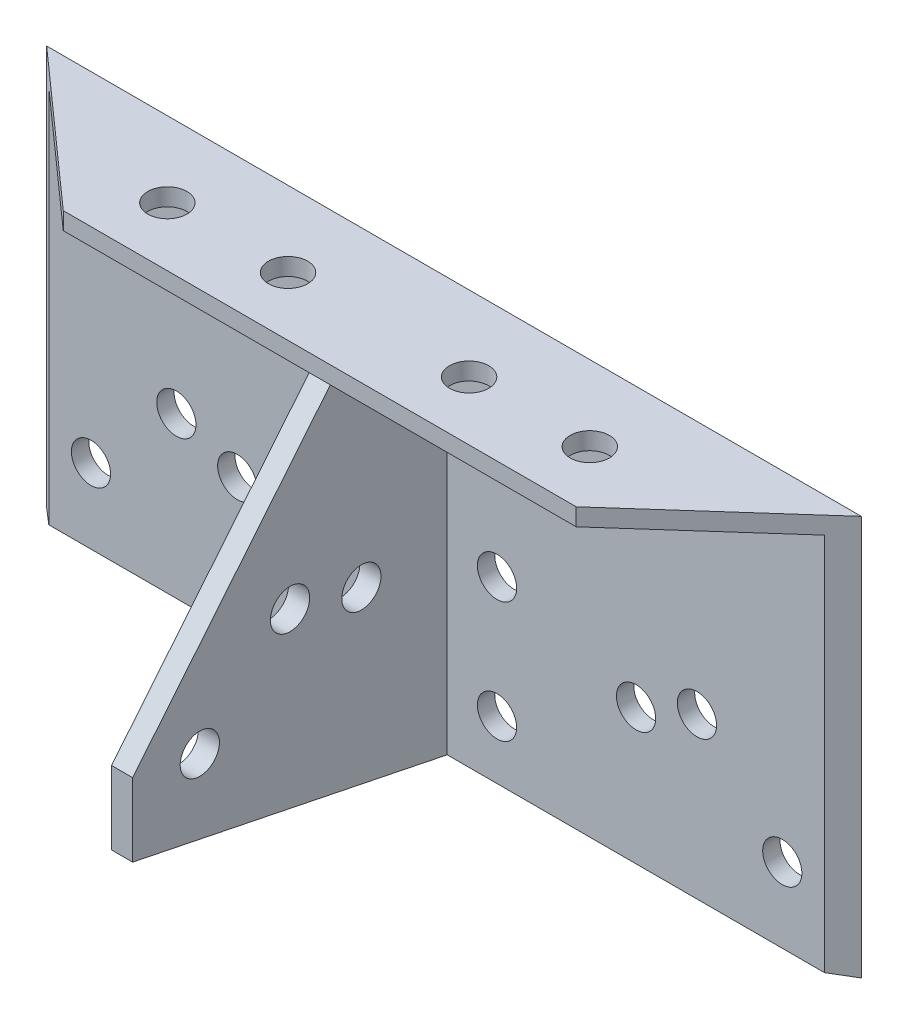
ISO-10303-21;
HEADER;
FILE_DESCRIPTION(('STEP AP214'),'2;1');
FILE_NAME('part.step','',(''),(''),'','','');
FILE_SCHEMA(('AUTOMOTIVE_DESIGN { 1 0 10303 214 1 1 1 1 }'));
ENDSEC;
DATA;
#1=APPLICATION_CONTEXT('core data for automotive mechanical design processes');
#2=APPLICATION_PROTOCOL_DEFINITION('international standard','automotive_design',2000,#1);
#3=PRODUCT_CONTEXT('',#1,'mechanical');
#4=PRODUCT('Part','Part','',(#3));
#5=PRODUCT_RELATED_PRODUCT_CATEGORY('part','',(#4));
#6=PRODUCT_DEFINITION_FORMATION('','',#4);
#7=PRODUCT_DEFINITION_CONTEXT('part definition',#1,'design');
#8=PRODUCT_DEFINITION('design','',#6,#7);
#9=PRODUCT_DEFINITION_SHAPE('','',#8);
#10=(LENGTH_UNIT() NAMED_UNIT(*) SI_UNIT(.MILLI.,.METRE.));
#11=(NAMED_UNIT(*) PLANE_ANGLE_UNIT() SI_UNIT($,.RADIAN.));
#12=(NAMED_UNIT(*) SI_UNIT($,.STERADIAN.) SOLID_ANGLE_UNIT());
#13=UNCERTAINTY_MEASURE_WITH_UNIT(LENGTH_MEASURE(1.E-05),#10,'distance_accuracy_value','');
#14=(GEOMETRIC_REPRESENTATION_CONTEXT(3) GLOBAL_UNCERTAINTY_ASSIGNED_CONTEXT((#13)) GLOBAL_UNIT_ASSIGNED_CONTEXT((#10,
#11,#12)) REPRESENTATION_CONTEXT('',''));
#15=CARTESIAN_POINT('',(0.,0.,0.));
#16=DIRECTION('',(0.,0.,1.));
#17=DIRECTION('',(1.,0.,0.));
#18=AXIS2_PLACEMENT_3D('',#15,#16,#17);
#19=CARTESIAN_POINT('',(0.,265.,11.5));
#20=DIRECTION('',(0.,0.,-1.));
#21=DIRECTION('',(-1.,0.,0.));
#22=AXIS2_PLACEMENT_3D('',#19,#20,#21);
#23=PLANE('',#22);
#24=CARTESIAN_POINT('',(230.,41.,11.5));
#25=DIRECTION('',(0.,0.,1.));
#26=DIRECTION('',(1.,0.,0.));
#27=AXIS2_PLACEMENT_3D('',#24,#25,#26);
#28=CIRCLE('',#27,13.);
#29=CARTESIAN_POINT('',(243.,41.,11.5));
#30=VERTEX_POINT('',#29);
#31=EDGE_CURVE('E655',#30,#30,#28,.T.);
#32=ORIENTED_EDGE('',*,*,#31,.F.);
#33=EDGE_LOOP('',(#32));
#34=FACE_BOUND('',#33,.T.);
#35=CARTESIAN_POINT('',(97.4659453904821,108.465945390483,11.5));
#36=DIRECTION('',(0.,0.,1.));
#37=DIRECTION('',(1.,0.,0.));
#38=AXIS2_PLACEMENT_3D('',#35,#36,#37);
#39=CIRCLE('',#38,13.);
#40=CARTESIAN_POINT('',(110.465945390482,108.465945390483,11.5));
#41=VERTEX_POINT('',#40);
#42=EDGE_CURVE('E314',#41,#41,#39,.T.);
#43=ORIENTED_EDGE('',*,*,#42,.F.);
#44=EDGE_LOOP('',(#43));
#45=FACE_BOUND('',#44,.T.);
#46=CARTESIAN_POINT('',(40.8974028955581,51.897402895559,11.5));
#47=DIRECTION('',(0.,0.,1.));
#48=DIRECTION('',(1.,0.,0.));
#49=AXIS2_PLACEMENT_3D('',#46,#47,#48);
#50=CIRCLE('',#49,13.);
#51=CARTESIAN_POINT('',(53.8974028955582,51.897402895559,11.5));
#52=VERTEX_POINT('',#51);
#53=EDGE_CURVE('E315',#52,#52,#50,.T.);
#54=ORIENTED_EDGE('',*,*,#53,.F.);
#55=EDGE_LOOP('',(#54));
#56=FACE_BOUND('',#55,.T.);
#57=CARTESIAN_POINT('',(230.,121.,11.5));
#58=DIRECTION('',(0.,0.,1.));
#59=DIRECTION('',(1.,0.,0.));
#60=AXIS2_PLACEMENT_3D('',#57,#58,#59);
#61=CIRCLE('',#60,13.);
#62=CARTESIAN_POINT('',(243.,121.,11.5));
#63=VERTEX_POINT('',#62);
#64=EDGE_CURVE('E633',#63,#63,#61,.T.);
#65=ORIENTED_EDGE('',*,*,#64,.F.);
#66=EDGE_LOOP('',(#65));
#67=FACE_BOUND('',#66,.T.);
#68=CARTESIAN_POINT('',(137.829012361263,92.2615340814046,11.5));
#69=DIRECTION('',(0.,0.,1.));
#70=DIRECTION('',(1.,0.,0.));
#71=AXIS2_PLACEMENT_3D('',#68,#69,#70);
#72=CIRCLE('',#71,13.);
#73=CARTESIAN_POINT('',(150.829012361263,92.2615340814046,11.5));
#74=VERTEX_POINT('',#73);
#75=EDGE_CURVE('E636',#74,#74,#72,.T.);
#76=ORIENTED_EDGE('',*,*,#75,.F.);
#77=EDGE_LOOP('',(#76));
#78=FACE_BOUND('',#77,.T.);
#79=DIRECTION('',(0.,-1.,0.));
#80=VECTOR('',#79,1.);
#81=CARTESIAN_POINT('',(12.9213483146067,265.,11.5));
#82=LINE('',#81,#80);
#83=CARTESIAN_POINT('',(12.9213483146067,253.5,11.5));
#84=VERTEX_POINT('',#83);
#85=CARTESIAN_POINT('',(12.9213483146067,2.35227272727279,11.5));
#86=VERTEX_POINT('',#85);
#87=EDGE_CURVE('E171',#84,#86,#82,.T.);
#88=ORIENTED_EDGE('',*,*,#87,.T.);
#89=DIRECTION('',(1.,0.,0.));
#90=VECTOR('',#89,1.);
#91=CARTESIAN_POINT('',(0.,2.35227272727279,11.5));
#92=LINE('',#91,#90);
#93=CARTESIAN_POINT('',(263.,2.35227272727273,11.5));
#94=VERTEX_POINT('',#93);
#95=EDGE_CURVE('E330',#86,#94,#92,.T.);
#96=ORIENTED_EDGE('',*,*,#95,.T.);
#97=DIRECTION('',(0.,-1.,0.));
#98=VECTOR('',#97,1.);
#99=CARTESIAN_POINT('',(263.,253.5,11.5));
#100=LINE('',#99,#98);
#101=CARTESIAN_POINT('',(263.,253.5,11.5));
#102=VERTEX_POINT('',#101);
#103=EDGE_CURVE('E329',#102,#94,#100,.T.);
#104=ORIENTED_EDGE('',*,*,#103,.F.);
#105=DIRECTION('',(1.,0.,0.));
#106=VECTOR('',#105,1.);
#107=CARTESIAN_POINT('',(0.,253.5,11.5));
#108=LINE('',#107,#106);
#109=EDGE_CURVE('E153',#84,#102,#108,.T.);
#110=ORIENTED_EDGE('',*,*,#109,.F.);
#111=EDGE_LOOP('',(#88,#96,#104,#110));
#112=FACE_BOUND('',#111,.T.);
#113=ADVANCED_FACE('F36',(#34,#45,#56,#67,#78,#112),#23,.F.);
#114=CARTESIAN_POINT('',(442.534054609518,108.465945390483,11.5));
#115=DIRECTION('',(0.,0.,1.));
#116=DIRECTION('',(-1.,0.,0.));
#117=AXIS2_PLACEMENT_3D('',#114,#115,#116);
#118=CIRCLE('',#117,13.);
#119=CARTESIAN_POINT('',(429.534054609518,108.465945390483,11.5));
#120=VERTEX_POINT('',#119);
#121=EDGE_CURVE('E642',#120,#120,#118,.T.);
#122=ORIENTED_EDGE('',*,*,#121,.F.);
#123=EDGE_LOOP('',(#122));
#124=FACE_BOUND('',#123,.T.);
#125=CARTESIAN_POINT('',(310.,121.,11.5));
#126=DIRECTION('',(0.,0.,1.));
#127=DIRECTION('',(-1.,0.,0.));
#128=AXIS2_PLACEMENT_3D('',#125,#126,#127);
#129=CIRCLE('',#128,13.);
#130=CARTESIAN_POINT('',(297.,121.,11.5));
#131=VERTEX_POINT('',#130);
#132=EDGE_CURVE('E639',#131,#131,#129,.T.);
#133=ORIENTED_EDGE('',*,*,#132,.F.);
#134=EDGE_LOOP('',(#133));
#135=FACE_BOUND('',#134,.T.);
#136=CARTESIAN_POINT('',(499.102597104442,51.8974028955591,11.5));
#137=DIRECTION('',(0.,0.,1.));
#138=DIRECTION('',(-1.,0.,0.));
#139=AXIS2_PLACEMENT_3D('',#136,#137,#138);
#140=CIRCLE('',#139,13.0000000000001);
#141=CARTESIAN_POINT('',(486.102597104442,51.8974028955591,11.5));
#142=VERTEX_POINT('',#141);
#143=EDGE_CURVE('E663',#142,#142,#140,.T.);
#144=ORIENTED_EDGE('',*,*,#143,.F.);
#145=EDGE_LOOP('',(#144));
#146=FACE_BOUND('',#145,.T.);
#147=CARTESIAN_POINT('',(310.,41.,11.5));
#148=DIRECTION('',(0.,0.,1.));
#149=DIRECTION('',(-1.,0.,0.));
#150=AXIS2_PLACEMENT_3D('',#147,#148,#149);
#151=CIRCLE('',#150,13.);
#152=CARTESIAN_POINT('',(297.,41.,11.5));
#153=VERTEX_POINT('',#152);
#154=EDGE_CURVE('E650',#153,#153,#151,.T.);
#155=ORIENTED_EDGE('',*,*,#154,.F.);
#156=EDGE_LOOP('',(#155));
#157=FACE_BOUND('',#156,.T.);
#158=CARTESIAN_POINT('',(402.170987638737,92.2615340814046,11.5));
#159=DIRECTION('',(0.,0.,1.));
#160=DIRECTION('',(-1.,0.,0.));
#161=AXIS2_PLACEMENT_3D('',#158,#159,#160);
#162=CIRCLE('',#161,13.);
#163=CARTESIAN_POINT('',(389.170987638737,92.2615340814046,11.5));
#164=VERTEX_POINT('',#163);
#165=EDGE_CURVE('E165',#164,#164,#162,.T.);
#166=ORIENTED_EDGE('',*,*,#165,.F.);
#167=EDGE_LOOP('',(#166));
#168=FACE_BOUND('',#167,.T.);
#169=DIRECTION('',(0.,1.,0.));
#170=VECTOR('',#169,1.);
#171=CARTESIAN_POINT('',(277.,253.5,11.5));
#172=LINE('',#171,#170);
#173=CARTESIAN_POINT('',(277.,2.35227272727274,11.5000000000001));
#174=VERTEX_POINT('',#173);
#175=CARTESIAN_POINT('',(277.,253.5,11.5));
#176=VERTEX_POINT('',#175);
#177=EDGE_CURVE('E232',#174,#176,#172,.T.);
#178=ORIENTED_EDGE('',*,*,#177,.F.);
#179=DIRECTION('',(-1.,0.,0.));
#180=VECTOR('',#179,1.);
#181=CARTESIAN_POINT('',(540.,2.35227272727274,11.5000000000001));
#182=LINE('',#181,#180);
#183=CARTESIAN_POINT('',(527.078651685393,2.35227272727274,11.5000000000001));
#184=VERTEX_POINT('',#183);
#185=EDGE_CURVE('E138',#184,#174,#182,.T.);
#186=ORIENTED_EDGE('',*,*,#185,.F.);
#187=DIRECTION('',(0.,1.,0.));
#188=VECTOR('',#187,1.);
#189=CARTESIAN_POINT('',(527.078651685393,265.,11.5));
#190=LINE('',#189,#188);
#191=CARTESIAN_POINT('',(527.078651685393,253.5,11.5));
#192=VERTEX_POINT('',#191);
#193=EDGE_CURVE('E136',#184,#192,#190,.T.);
#194=ORIENTED_EDGE('',*,*,#193,.T.);
#195=EDGE_CURVE('E158',#176,#192,#108,.T.);
#196=ORIENTED_EDGE('',*,*,#195,.F.);
#197=EDGE_LOOP('',(#178,#186,#194,#196));
#198=FACE_BOUND('',#197,.T.);
#199=ADVANCED_FACE('F274',(#124,#135,#146,#157,#168,#198),#23,.F.);
#200=CARTESIAN_POINT('',(0.,253.5,89.));
#201=DIRECTION('',(0.,1.,0.));
#202=DIRECTION('',(0.,0.,1.));
#203=AXIS2_PLACEMENT_3D('',#200,#201,#202);
#204=PLANE('',#203);
#205=CARTESIAN_POINT('',(210.,253.5,50.));
#206=DIRECTION('',(0.,1.,0.));
#207=DIRECTION('',(0.,0.,1.));
#208=AXIS2_PLACEMENT_3D('',#205,#206,#207);
#209=CIRCLE('',#208,13.);
#210=CARTESIAN_POINT('',(210.,253.5,63.));
#211=VERTEX_POINT('',#210);
#212=EDGE_CURVE('E191',#211,#211,#209,.T.);
#213=ORIENTED_EDGE('',*,*,#212,.T.);
#214=EDGE_LOOP('',(#213));
#215=FACE_BOUND('',#214,.T.);
#216=CARTESIAN_POINT('',(130.,253.5,50.));
#217=DIRECTION('',(0.,1.,0.));
#218=DIRECTION('',(0.,0.,1.));
#219=AXIS2_PLACEMENT_3D('',#216,#217,#218);
#220=CIRCLE('',#219,13.);
#221=CARTESIAN_POINT('',(130.,253.5,63.));
#222=VERTEX_POINT('',#221);
#223=EDGE_CURVE('E243',#222,#222,#220,.T.);
#224=ORIENTED_EDGE('',*,*,#223,.T.);
#225=EDGE_LOOP('',(#224));
#226=FACE_BOUND('',#225,.T.);
#227=DIRECTION('',(0.,0.,-1.));
#228=VECTOR('',#227,1.);
#229=CARTESIAN_POINT('',(263.,253.5,220.));
#230=LINE('',#229,#228);
#231=CARTESIAN_POINT('',(263.,253.5,89.));
#232=VERTEX_POINT('',#231);
#233=EDGE_CURVE('E215',#232,#102,#230,.T.);
#234=ORIENTED_EDGE('',*,*,#233,.F.);
#235=DIRECTION('',(1.,0.,0.));
#236=VECTOR('',#235,1.);
#237=CARTESIAN_POINT('',(0.,253.5,89.));
#238=LINE('',#237,#236);
#239=CARTESIAN_POINT('',(100.,253.5,89.));
#240=VERTEX_POINT('',#239);
#241=EDGE_CURVE('E200',#240,#232,#238,.T.);
#242=ORIENTED_EDGE('',*,*,#241,.F.);
#243=DIRECTION('',(-0.746997038573461,0.,-0.66482736433038));
#244=VECTOR('',#243,1.);
#245=CARTESIAN_POINT('',(44.199542436248,253.5,39.3375927682607));
#246=LINE('',#245,#244);
#247=EDGE_CURVE('E196',#240,#84,#246,.T.);
#248=ORIENTED_EDGE('',*,*,#247,.T.);
#249=ORIENTED_EDGE('',*,*,#109,.T.);
#250=EDGE_LOOP('',(#234,#242,#248,#249));
#251=FACE_BOUND('',#250,.T.);
#252=ADVANCED_FACE('F223',(#215,#226,#251),#204,.F.);
#253=CARTESIAN_POINT('',(410.,253.5,50.));
#254=DIRECTION('',(0.,1.,0.));
#255=DIRECTION('',(0.,0.,1.));
#256=AXIS2_PLACEMENT_3D('',#253,#254,#255);
#257=CIRCLE('',#256,13.);
#258=CARTESIAN_POINT('',(410.,253.5,63.));
#259=VERTEX_POINT('',#258);
#260=EDGE_CURVE('E240',#259,#259,#257,.T.);
#261=ORIENTED_EDGE('',*,*,#260,.T.);
#262=EDGE_LOOP('',(#261));
#263=FACE_BOUND('',#262,.T.);
#264=CARTESIAN_POINT('',(330.,253.5,50.));
#265=DIRECTION('',(0.,1.,0.));
#266=DIRECTION('',(0.,0.,1.));
#267=AXIS2_PLACEMENT_3D('',#264,#265,#266);
#268=CIRCLE('',#267,13.);
#269=CARTESIAN_POINT('',(330.,253.5,62.9999999999999));
#270=VERTEX_POINT('',#269);
#271=EDGE_CURVE('E172',#270,#270,#268,.T.);
#272=ORIENTED_EDGE('',*,*,#271,.T.);
#273=EDGE_LOOP('',(#272));
#274=FACE_BOUND('',#273,.T.);
#275=DIRECTION('',(0.,0.,-1.));
#276=VECTOR('',#275,1.);
#277=CARTESIAN_POINT('',(277.,253.5,220.));
#278=LINE('',#277,#276);
#279=CARTESIAN_POINT('',(277.,253.5,89.));
#280=VERTEX_POINT('',#279);
#281=EDGE_CURVE('E225',#280,#176,#278,.T.);
#282=ORIENTED_EDGE('',*,*,#281,.T.);
#283=ORIENTED_EDGE('',*,*,#195,.T.);
#284=DIRECTION('',(-0.746997038573461,0.,0.66482736433038));
#285=VECTOR('',#284,1.);
#286=CARTESIAN_POINT('',(194.477986719491,253.5,307.514591819653));
#287=LINE('',#286,#285);
#288=CARTESIAN_POINT('',(440.,253.5,89.));
#289=VERTEX_POINT('',#288);
#290=EDGE_CURVE('E178',#192,#289,#287,.T.);
#291=ORIENTED_EDGE('',*,*,#290,.T.);
#292=EDGE_CURVE('E157',#280,#289,#238,.T.);
#293=ORIENTED_EDGE('',*,*,#292,.F.);
#294=EDGE_LOOP('',(#282,#283,#291,#293));
#295=FACE_BOUND('',#294,.T.);
#296=ADVANCED_FACE('F185',(#263,#274,#295),#204,.F.);
#297=CARTESIAN_POINT('',(0.,265.,0.));
#298=DIRECTION('',(0.,0.,-1.));
#299=DIRECTION('',(-1.,0.,0.));
#300=AXIS2_PLACEMENT_3D('',#297,#298,#299);
#301=PLANE('',#300);
#302=CARTESIAN_POINT('',(442.534054609518,108.465945390483,0.));
#303=DIRECTION('',(0.,0.,1.));
#304=DIRECTION('',(-1.,0.,0.));
#305=AXIS2_PLACEMENT_3D('',#302,#303,#304);
#306=CIRCLE('',#305,13.);
#307=CARTESIAN_POINT('',(429.534054609518,108.465945390483,0.));
#308=VERTEX_POINT('',#307);
#309=EDGE_CURVE('E297',#308,#308,#306,.T.);
#310=ORIENTED_EDGE('',*,*,#309,.T.);
#311=EDGE_LOOP('',(#310));
#312=FACE_BOUND('',#311,.T.);
#313=CARTESIAN_POINT('',(310.,121.,0.));
#314=DIRECTION('',(0.,0.,1.));
#315=DIRECTION('',(-1.,0.,0.));
#316=AXIS2_PLACEMENT_3D('',#313,#314,#315);
#317=CIRCLE('',#316,13.);
#318=CARTESIAN_POINT('',(297.,121.,0.));
#319=VERTEX_POINT('',#318);
#320=EDGE_CURVE('E301',#319,#319,#317,.T.);
#321=ORIENTED_EDGE('',*,*,#320,.T.);
#322=EDGE_LOOP('',(#321));
#323=FACE_BOUND('',#322,.T.);
#324=CARTESIAN_POINT('',(230.,41.,0.));
#325=DIRECTION('',(0.,0.,1.));
#326=DIRECTION('',(1.,0.,0.));
#327=AXIS2_PLACEMENT_3D('',#324,#325,#326);
#328=CIRCLE('',#327,13.);
#329=CARTESIAN_POINT('',(243.,41.,0.));
#330=VERTEX_POINT('',#329);
#331=EDGE_CURVE('E305',#330,#330,#328,.T.);
#332=ORIENTED_EDGE('',*,*,#331,.T.);
#333=EDGE_LOOP('',(#332));
#334=FACE_BOUND('',#333,.T.);
#335=CARTESIAN_POINT('',(499.102597104442,51.8974028955591,0.));
#336=DIRECTION('',(0.,0.,1.));
#337=DIRECTION('',(-1.,0.,0.));
#338=AXIS2_PLACEMENT_3D('',#335,#336,#337);
#339=CIRCLE('',#338,13.0000000000001);
#340=CARTESIAN_POINT('',(486.102597104442,51.8974028955591,0.));
#341=VERTEX_POINT('',#340);
#342=EDGE_CURVE('E309',#341,#341,#339,.T.);
#343=ORIENTED_EDGE('',*,*,#342,.T.);
#344=EDGE_LOOP('',(#343));
#345=FACE_BOUND('',#344,.T.);
#346=CARTESIAN_POINT('',(97.4659453904821,108.465945390483,0.));
#347=DIRECTION('',(0.,0.,1.));
#348=DIRECTION('',(1.,0.,0.));
#349=AXIS2_PLACEMENT_3D('',#346,#347,#348);
#350=CIRCLE('',#349,13.);
#351=CARTESIAN_POINT('',(110.465945390482,108.465945390483,0.));
#352=VERTEX_POINT('',#351);
#353=EDGE_CURVE('E312',#352,#352,#350,.T.);
#354=ORIENTED_EDGE('',*,*,#353,.T.);
#355=EDGE_LOOP('',(#354));
#356=FACE_BOUND('',#355,.T.);
#357=DIRECTION('',(0.,-1.,0.));
#358=VECTOR('',#357,1.);
#359=CARTESIAN_POINT('',(0.,0.,0.));
#360=LINE('',#359,#358);
#361=CARTESIAN_POINT('',(0.,265.,0.));
#362=VERTEX_POINT('',#361);
#363=CARTESIAN_POINT('',(0.,0.,0.));
#364=VERTEX_POINT('',#363);
#365=EDGE_CURVE('E129',#362,#364,#360,.T.);
#366=ORIENTED_EDGE('',*,*,#365,.F.);
#367=DIRECTION('',(-1.,0.,0.));
#368=VECTOR('',#367,1.);
#369=CARTESIAN_POINT('',(0.,265.,0.));
#370=LINE('',#369,#368);
#371=CARTESIAN_POINT('',(540.,265.,0.));
#372=VERTEX_POINT('',#371);
#373=EDGE_CURVE('E144',#372,#362,#370,.T.);
#374=ORIENTED_EDGE('',*,*,#373,.F.);
#375=DIRECTION('',(0.,1.,0.));
#376=VECTOR('',#375,1.);
#377=CARTESIAN_POINT('',(540.,0.,0.));
#378=LINE('',#377,#376);
#379=CARTESIAN_POINT('',(540.,0.,0.));
#380=VERTEX_POINT('',#379);
#381=EDGE_CURVE('E128',#380,#372,#378,.T.);
#382=ORIENTED_EDGE('',*,*,#381,.F.);
#383=DIRECTION('',(1.,0.,0.));
#384=VECTOR('',#383,1.);
#385=CARTESIAN_POINT('',(0.,0.,0.));
#386=LINE('',#385,#384);
#387=EDGE_CURVE('E117',#364,#380,#386,.T.);
#388=ORIENTED_EDGE('',*,*,#387,.F.);
#389=EDGE_LOOP('',(#366,#374,#382,#388));
#390=FACE_BOUND('',#389,.T.);
#391=CARTESIAN_POINT('',(40.8974028955581,51.897402895559,0.));
#392=DIRECTION('',(0.,0.,1.));
#393=DIRECTION('',(1.,0.,0.));
#394=AXIS2_PLACEMENT_3D('',#391,#392,#393);
#395=CIRCLE('',#394,13.);
#396=CARTESIAN_POINT('',(53.8974028955582,51.897402895559,0.));
#397=VERTEX_POINT('',#396);
#398=EDGE_CURVE('E320',#397,#397,#395,.T.);
#399=ORIENTED_EDGE('',*,*,#398,.T.);
#400=EDGE_LOOP('',(#399));
#401=FACE_BOUND('',#400,.T.);
#402=CARTESIAN_POINT('',(230.,121.,0.));
#403=DIRECTION('',(0.,0.,1.));
#404=DIRECTION('',(1.,0.,0.));
#405=AXIS2_PLACEMENT_3D('',#402,#403,#404);
#406=CIRCLE('',#405,13.);
#407=CARTESIAN_POINT('',(243.,121.,0.));
#408=VERTEX_POINT('',#407);
#409=EDGE_CURVE('E658',#408,#408,#406,.T.);
#410=ORIENTED_EDGE('',*,*,#409,.T.);
#411=EDGE_LOOP('',(#410));
#412=FACE_BOUND('',#411,.T.);
#413=CARTESIAN_POINT('',(310.,41.,0.));
#414=DIRECTION('',(0.,0.,1.));
#415=DIRECTION('',(-1.,0.,0.));
#416=AXIS2_PLACEMENT_3D('',#413,#414,#415);
#417=CIRCLE('',#416,13.);
#418=CARTESIAN_POINT('',(297.,41.,0.));
#419=VERTEX_POINT('',#418);
#420=EDGE_CURVE('E648',#419,#419,#417,.T.);
#421=ORIENTED_EDGE('',*,*,#420,.T.);
#422=EDGE_LOOP('',(#421));
#423=FACE_BOUND('',#422,.T.);
#424=CARTESIAN_POINT('',(137.829012361263,92.2615340814046,0.));
#425=DIRECTION('',(0.,0.,1.));
#426=DIRECTION('',(1.,0.,0.));
#427=AXIS2_PLACEMENT_3D('',#424,#425,#426);
#428=CIRCLE('',#427,13.);
#429=CARTESIAN_POINT('',(150.829012361263,92.2615340814046,0.));
#430=VERTEX_POINT('',#429);
#431=EDGE_CURVE('E637',#430,#430,#428,.T.);
#432=ORIENTED_EDGE('',*,*,#431,.T.);
#433=EDGE_LOOP('',(#432));
#434=FACE_BOUND('',#433,.T.);
#435=CARTESIAN_POINT('',(402.170987638737,92.2615340814046,0.));
#436=DIRECTION('',(0.,0.,1.));
#437=DIRECTION('',(-1.,0.,0.));
#438=AXIS2_PLACEMENT_3D('',#435,#436,#437);
#439=CIRCLE('',#438,13.);
#440=CARTESIAN_POINT('',(389.170987638737,92.2615340814046,0.));
#441=VERTEX_POINT('',#440);
#442=EDGE_CURVE('E205',#441,#441,#439,.T.);
#443=ORIENTED_EDGE('',*,*,#442,.T.);
#444=EDGE_LOOP('',(#443));
#445=FACE_BOUND('',#444,.T.);
#446=ADVANCED_FACE('F141',(#312,#323,#334,#345,#356,#390,#401,#412,#423,#434,#445),#301,.T.);
#447=CARTESIAN_POINT('',(0.,265.,11.5));
#448=DIRECTION('',(0.,-1.,0.));
#449=DIRECTION('',(0.,0.,-1.));
#450=AXIS2_PLACEMENT_3D('',#447,#448,#449);
#451=PLANE('',#450);
#452=CARTESIAN_POINT('',(330.,265.,50.));
#453=DIRECTION('',(0.,1.,0.));
#454=DIRECTION('',(0.,0.,-1.));
#455=AXIS2_PLACEMENT_3D('',#452,#453,#454);
#456=CIRCLE('',#455,13.);
#457=CARTESIAN_POINT('',(330.,265.,37.));
#458=VERTEX_POINT('',#457);
#459=EDGE_CURVE('E228',#458,#458,#456,.T.);
#460=ORIENTED_EDGE('',*,*,#459,.F.);
#461=EDGE_LOOP('',(#460));
#462=FACE_BOUND('',#461,.T.);
#463=CARTESIAN_POINT('',(410.,265.,50.));
#464=DIRECTION('',(0.,1.,0.));
#465=DIRECTION('',(0.,0.,-1.));
#466=AXIS2_PLACEMENT_3D('',#463,#464,#465);
#467=CIRCLE('',#466,13.);
#468=CARTESIAN_POINT('',(410.,265.,37.));
#469=VERTEX_POINT('',#468);
#470=EDGE_CURVE('E237',#469,#469,#467,.T.);
#471=ORIENTED_EDGE('',*,*,#470,.F.);
#472=EDGE_LOOP('',(#471));
#473=FACE_BOUND('',#472,.T.);
#474=CARTESIAN_POINT('',(130.,265.,50.));
#475=DIRECTION('',(0.,1.,0.));
#476=DIRECTION('',(0.,0.,1.));
#477=AXIS2_PLACEMENT_3D('',#474,#475,#476);
#478=CIRCLE('',#477,13.);
#479=CARTESIAN_POINT('',(130.,265.,63.));
#480=VERTEX_POINT('',#479);
#481=EDGE_CURVE('E241',#480,#480,#478,.T.);
#482=ORIENTED_EDGE('',*,*,#481,.F.);
#483=EDGE_LOOP('',(#482));
#484=FACE_BOUND('',#483,.T.);
#485=CARTESIAN_POINT('',(210.,265.,50.));
#486=DIRECTION('',(0.,1.,0.));
#487=DIRECTION('',(0.,0.,1.));
#488=AXIS2_PLACEMENT_3D('',#485,#486,#487);
#489=CIRCLE('',#488,13.);
#490=CARTESIAN_POINT('',(210.,265.,63.));
#491=VERTEX_POINT('',#490);
#492=EDGE_CURVE('E244',#491,#491,#489,.T.);
#493=ORIENTED_EDGE('',*,*,#492,.F.);
#494=EDGE_LOOP('',(#493));
#495=FACE_BOUND('',#494,.T.);
#496=DIRECTION('',(-1.,0.,0.));
#497=VECTOR('',#496,1.);
#498=CARTESIAN_POINT('',(0.,265.,89.));
#499=LINE('',#498,#497);
#500=CARTESIAN_POINT('',(440.,265.,89.));
#501=VERTEX_POINT('',#500);
#502=CARTESIAN_POINT('',(100.,265.,89.));
#503=VERTEX_POINT('',#502);
#504=EDGE_CURVE('E163',#501,#503,#499,.T.);
#505=ORIENTED_EDGE('',*,*,#504,.F.);
#506=DIRECTION('',(-0.746997038573461,0.,0.66482736433038));
#507=VECTOR('',#506,1.);
#508=CARTESIAN_POINT('',(540.,265.,0.));
#509=LINE('',#508,#507);
#510=EDGE_CURVE('E179',#372,#501,#509,.T.);
#511=ORIENTED_EDGE('',*,*,#510,.F.);
#512=ORIENTED_EDGE('',*,*,#373,.T.);
#513=DIRECTION('',(-0.746997038573461,0.,-0.66482736433038));
#514=VECTOR('',#513,1.);
#515=CARTESIAN_POINT('',(0.,265.,0.));
#516=LINE('',#515,#514);
#517=EDGE_CURVE('E189',#503,#362,#516,.T.);
#518=ORIENTED_EDGE('',*,*,#517,.F.);
#519=EDGE_LOOP('',(#505,#511,#512,#518));
#520=FACE_BOUND('',#519,.T.);
#521=ADVANCED_FACE('F38',(#462,#473,#484,#495,#520),#451,.F.);
#522=CARTESIAN_POINT('',(97.4659453904821,108.465945390483,11.5));
#523=DIRECTION('',(0.,0.,-1.));
#524=DIRECTION('',(-1.,0.,0.));
#525=AXIS2_PLACEMENT_3D('',#522,#523,#524);
#526=CYLINDRICAL_SURFACE('',#525,13.);
#527=ORIENTED_EDGE('',*,*,#42,.T.);
#528=EDGE_LOOP('',(#527));
#529=FACE_BOUND('',#528,.T.);
#530=ORIENTED_EDGE('',*,*,#353,.F.);
#531=EDGE_LOOP('',(#530));
#532=FACE_BOUND('',#531,.T.);
#533=ADVANCED_FACE('F284',(#529,#532),#526,.F.);
#534=CARTESIAN_POINT('',(40.8974028955581,51.897402895559,11.5));
#535=DIRECTION('',(0.,0.,-1.));
#536=DIRECTION('',(-1.,0.,0.));
#537=AXIS2_PLACEMENT_3D('',#534,#535,#536);
#538=CYLINDRICAL_SURFACE('',#537,13.);
#539=ORIENTED_EDGE('',*,*,#53,.T.);
#540=EDGE_LOOP('',(#539));
#541=FACE_BOUND('',#540,.T.);
#542=ORIENTED_EDGE('',*,*,#398,.F.);
#543=EDGE_LOOP('',(#542));
#544=FACE_BOUND('',#543,.T.);
#545=ADVANCED_FACE('F586',(#541,#544),#538,.F.);
#546=CARTESIAN_POINT('',(499.102597104442,51.8974028955591,11.5));
#547=DIRECTION('',(0.,0.,-1.));
#548=DIRECTION('',(-1.,0.,0.));
#549=AXIS2_PLACEMENT_3D('',#546,#547,#548);
#550=CYLINDRICAL_SURFACE('',#549,13.0000000000001);
#551=ORIENTED_EDGE('',*,*,#143,.T.);
#552=EDGE_LOOP('',(#551));
#553=FACE_BOUND('',#552,.T.);
#554=ORIENTED_EDGE('',*,*,#342,.F.);
#555=EDGE_LOOP('',(#554));
#556=FACE_BOUND('',#555,.T.);
#557=ADVANCED_FACE('F576',(#553,#556),#550,.F.);
#558=CARTESIAN_POINT('',(230.,121.,11.5));
#559=DIRECTION('',(0.,0.,-1.));
#560=DIRECTION('',(-1.,0.,0.));
#561=AXIS2_PLACEMENT_3D('',#558,#559,#560);
#562=CYLINDRICAL_SURFACE('',#561,13.);
#563=ORIENTED_EDGE('',*,*,#64,.T.);
#564=EDGE_LOOP('',(#563));
#565=FACE_BOUND('',#564,.T.);
#566=ORIENTED_EDGE('',*,*,#409,.F.);
#567=EDGE_LOOP('',(#566));
#568=FACE_BOUND('',#567,.T.);
#569=ADVANCED_FACE('F566',(#565,#568),#562,.F.);
#570=CARTESIAN_POINT('',(230.,41.,11.5));
#571=DIRECTION('',(0.,0.,-1.));
#572=DIRECTION('',(-1.,0.,0.));
#573=AXIS2_PLACEMENT_3D('',#570,#571,#572);
#574=CYLINDRICAL_SURFACE('',#573,13.);
#575=ORIENTED_EDGE('',*,*,#31,.T.);
#576=EDGE_LOOP('',(#575));
#577=FACE_BOUND('',#576,.T.);
#578=ORIENTED_EDGE('',*,*,#331,.F.);
#579=EDGE_LOOP('',(#578));
#580=FACE_BOUND('',#579,.T.);
#581=ADVANCED_FACE('F556',(#577,#580),#574,.F.);
#582=CARTESIAN_POINT('',(310.,41.,11.5));
#583=DIRECTION('',(0.,0.,-1.));
#584=DIRECTION('',(-1.,0.,0.));
#585=AXIS2_PLACEMENT_3D('',#582,#583,#584);
#586=CYLINDRICAL_SURFACE('',#585,13.);
#587=ORIENTED_EDGE('',*,*,#154,.T.);
#588=EDGE_LOOP('',(#587));
#589=FACE_BOUND('',#588,.T.);
#590=ORIENTED_EDGE('',*,*,#420,.F.);
#591=EDGE_LOOP('',(#590));
#592=FACE_BOUND('',#591,.T.);
#593=ADVANCED_FACE('F546',(#589,#592),#586,.F.);
#594=CARTESIAN_POINT('',(310.,121.,11.5));
#595=DIRECTION('',(0.,0.,-1.));
#596=DIRECTION('',(-1.,0.,0.));
#597=AXIS2_PLACEMENT_3D('',#594,#595,#596);
#598=CYLINDRICAL_SURFACE('',#597,13.);
#599=ORIENTED_EDGE('',*,*,#132,.T.);
#600=EDGE_LOOP('',(#599));
#601=FACE_BOUND('',#600,.T.);
#602=ORIENTED_EDGE('',*,*,#320,.F.);
#603=EDGE_LOOP('',(#602));
#604=FACE_BOUND('',#603,.T.);
#605=ADVANCED_FACE('F536',(#601,#604),#598,.F.);
#606=CARTESIAN_POINT('',(137.829012361263,92.2615340814046,11.5));
#607=DIRECTION('',(0.,0.,-1.));
#608=DIRECTION('',(-1.,0.,0.));
#609=AXIS2_PLACEMENT_3D('',#606,#607,#608);
#610=CYLINDRICAL_SURFACE('',#609,13.);
#611=ORIENTED_EDGE('',*,*,#75,.T.);
#612=EDGE_LOOP('',(#611));
#613=FACE_BOUND('',#612,.T.);
#614=ORIENTED_EDGE('',*,*,#431,.F.);
#615=EDGE_LOOP('',(#614));
#616=FACE_BOUND('',#615,.T.);
#617=ADVANCED_FACE('F526',(#613,#616),#610,.F.);
#618=CARTESIAN_POINT('',(442.534054609518,108.465945390483,11.5));
#619=DIRECTION('',(0.,0.,-1.));
#620=DIRECTION('',(-1.,0.,0.));
#621=AXIS2_PLACEMENT_3D('',#618,#619,#620);
#622=CYLINDRICAL_SURFACE('',#621,13.);
#623=ORIENTED_EDGE('',*,*,#121,.T.);
#624=EDGE_LOOP('',(#623));
#625=FACE_BOUND('',#624,.T.);
#626=ORIENTED_EDGE('',*,*,#309,.F.);
#627=EDGE_LOOP('',(#626));
#628=FACE_BOUND('',#627,.T.);
#629=ADVANCED_FACE('F516',(#625,#628),#622,.F.);
#630=CARTESIAN_POINT('',(402.170987638737,92.2615340814046,11.5));
#631=DIRECTION('',(0.,0.,-1.));
#632=DIRECTION('',(-1.,0.,0.));
#633=AXIS2_PLACEMENT_3D('',#630,#631,#632);
#634=CYLINDRICAL_SURFACE('',#633,13.);
#635=ORIENTED_EDGE('',*,*,#165,.T.);
#636=EDGE_LOOP('',(#635));
#637=FACE_BOUND('',#636,.T.);
#638=ORIENTED_EDGE('',*,*,#442,.F.);
#639=EDGE_LOOP('',(#638));
#640=FACE_BOUND('',#639,.T.);
#641=ADVANCED_FACE('F457',(#637,#640),#634,.F.);
#642=CARTESIAN_POINT('',(0.,253.5,89.));
#643=DIRECTION('',(0.,0.,1.));
#644=DIRECTION('',(1.,0.,0.));
#645=AXIS2_PLACEMENT_3D('',#642,#643,#644);
#646=PLANE('',#645);
#647=DIRECTION('',(0.,-1.,0.));
#648=VECTOR('',#647,1.);
#649=CARTESIAN_POINT('',(440.,253.5,89.));
#650=LINE('',#649,#648);
#651=EDGE_CURVE('E152',#501,#289,#650,.T.);
#652=ORIENTED_EDGE('',*,*,#651,.F.);
#653=ORIENTED_EDGE('',*,*,#504,.T.);
#654=DIRECTION('',(0.,1.,0.));
#655=VECTOR('',#654,1.);
#656=CARTESIAN_POINT('',(100.,253.5,89.));
#657=LINE('',#656,#655);
#658=EDGE_CURVE('E146',#240,#503,#657,.T.);
#659=ORIENTED_EDGE('',*,*,#658,.F.);
#660=ORIENTED_EDGE('',*,*,#241,.T.);
#661=EDGE_CURVE('E202',#232,#280,#238,.T.);
#662=ORIENTED_EDGE('',*,*,#661,.T.);
#663=ORIENTED_EDGE('',*,*,#292,.T.);
#664=EDGE_LOOP('',(#652,#653,#659,#660,#662,#663));
#665=FACE_BOUND('',#664,.T.);
#666=ADVANCED_FACE('F206',(#665),#646,.T.);
#667=CARTESIAN_POINT('',(0.,-2.50000000145967E-05,0.));
#668=DIRECTION('',(0.66482736433038,0.,-0.746997038573461));
#669=DIRECTION('',(-0.746997038573461,0.,-0.66482736433038));
#670=AXIS2_PLACEMENT_3D('',#667,#668,#669);
#671=PLANE('',#670);
#672=ORIENTED_EDGE('',*,*,#365,.T.);
#673=DIRECTION('',(0.740184431111828,0.134747211209222,0.658764143689527));
#674=VECTOR('',#673,1.);
#675=CARTESIAN_POINT('',(-2.49344469740945E-06,-4.53920282011262E-07,-2.21916578069441E-06));
#676=LINE('',#675,#674);
#677=EDGE_CURVE('E123',#364,#86,#676,.T.);
#678=ORIENTED_EDGE('',*,*,#677,.T.);
#679=ORIENTED_EDGE('',*,*,#87,.F.);
#680=ORIENTED_EDGE('',*,*,#247,.F.);
#681=ORIENTED_EDGE('',*,*,#658,.T.);
#682=ORIENTED_EDGE('',*,*,#517,.T.);
#683=EDGE_LOOP('',(#672,#678,#679,#680,#681,#682));
#684=FACE_BOUND('',#683,.T.);
#685=ADVANCED_FACE('F324',(#684),#671,.F.);
#686=CARTESIAN_POINT('',(540.,-2.50000000145967E-05,0.));
#687=DIRECTION('',(-0.66482736433038,0.,-0.746997038573461));
#688=DIRECTION('',(-0.746997038573461,0.,0.66482736433038));
#689=AXIS2_PLACEMENT_3D('',#686,#687,#688);
#690=PLANE('',#689);
#691=ORIENTED_EDGE('',*,*,#193,.F.);
#692=DIRECTION('',(0.740184431111828,-0.134747211209221,-0.658764143689527));
#693=VECTOR('',#692,1.);
#694=CARTESIAN_POINT('',(540.000002493445,-4.53920273481593E-07,-2.21916578146556E-06));
#695=LINE('',#694,#693);
#696=EDGE_CURVE('E120',#184,#380,#695,.T.);
#697=ORIENTED_EDGE('',*,*,#696,.T.);
#698=ORIENTED_EDGE('',*,*,#381,.T.);
#699=ORIENTED_EDGE('',*,*,#510,.T.);
#700=ORIENTED_EDGE('',*,*,#651,.T.);
#701=ORIENTED_EDGE('',*,*,#290,.F.);
#702=EDGE_LOOP('',(#691,#697,#698,#699,#700,#701));
#703=FACE_BOUND('',#702,.T.);
#704=ADVANCED_FACE('F133',(#703),#690,.F.);
#705=CARTESIAN_POINT('',(210.,0.,50.));
#706=DIRECTION('',(0.,1.,0.));
#707=DIRECTION('',(0.,0.,1.));
#708=AXIS2_PLACEMENT_3D('',#705,#706,#707);
#709=CYLINDRICAL_SURFACE('',#708,13.);
#710=ORIENTED_EDGE('',*,*,#492,.T.);
#711=EDGE_LOOP('',(#710));
#712=FACE_BOUND('',#711,.T.);
#713=ORIENTED_EDGE('',*,*,#212,.F.);
#714=EDGE_LOOP('',(#713));
#715=FACE_BOUND('',#714,.T.);
#716=ADVANCED_FACE('F270',(#712,#715),#709,.F.);
#717=CARTESIAN_POINT('',(130.,0.,50.));
#718=DIRECTION('',(0.,1.,0.));
#719=DIRECTION('',(0.,0.,1.));
#720=AXIS2_PLACEMENT_3D('',#717,#718,#719);
#721=CYLINDRICAL_SURFACE('',#720,13.);
#722=ORIENTED_EDGE('',*,*,#481,.T.);
#723=EDGE_LOOP('',(#722));
#724=FACE_BOUND('',#723,.T.);
#725=ORIENTED_EDGE('',*,*,#223,.F.);
#726=EDGE_LOOP('',(#725));
#727=FACE_BOUND('',#726,.T.);
#728=ADVANCED_FACE('F261',(#724,#727),#721,.F.);
#729=CARTESIAN_POINT('',(410.,0.,50.));
#730=DIRECTION('',(0.,1.,0.));
#731=DIRECTION('',(0.,0.,1.));
#732=AXIS2_PLACEMENT_3D('',#729,#730,#731);
#733=CYLINDRICAL_SURFACE('',#732,13.);
#734=ORIENTED_EDGE('',*,*,#470,.T.);
#735=EDGE_LOOP('',(#734));
#736=FACE_BOUND('',#735,.T.);
#737=ORIENTED_EDGE('',*,*,#260,.F.);
#738=EDGE_LOOP('',(#737));
#739=FACE_BOUND('',#738,.T.);
#740=ADVANCED_FACE('F258',(#736,#739),#733,.F.);
#741=CARTESIAN_POINT('',(330.,0.,50.));
#742=DIRECTION('',(0.,1.,0.));
#743=DIRECTION('',(0.,0.,1.));
#744=AXIS2_PLACEMENT_3D('',#741,#742,#743);
#745=CYLINDRICAL_SURFACE('',#744,13.);
#746=ORIENTED_EDGE('',*,*,#459,.T.);
#747=EDGE_LOOP('',(#746));
#748=FACE_BOUND('',#747,.T.);
#749=ORIENTED_EDGE('',*,*,#271,.F.);
#750=EDGE_LOOP('',(#749));
#751=FACE_BOUND('',#750,.T.);
#752=ADVANCED_FACE('F260',(#748,#751),#745,.F.);
#753=CARTESIAN_POINT('',(263.,253.5,220.));
#754=DIRECTION('',(1.,0.,0.));
#755=DIRECTION('',(0.,1.,0.));
#756=AXIS2_PLACEMENT_3D('',#753,#754,#755);
#757=PLANE('',#756);
#758=CARTESIAN_POINT('',(263.,126.937989210427,68.4004213366659));
#759=DIRECTION('',(1.,0.,0.));
#760=DIRECTION('',(0.,1.,0.));
#761=AXIS2_PLACEMENT_3D('',#758,#759,#760);
#762=CIRCLE('',#761,13.);
#763=CARTESIAN_POINT('',(263.,139.937989210427,68.4004213366659));
#764=VERTEX_POINT('',#763);
#765=EDGE_CURVE('E350',#764,#764,#762,.T.);
#766=ORIENTED_EDGE('',*,*,#765,.T.);
#767=EDGE_LOOP('',(#766));
#768=FACE_BOUND('',#767,.T.);
#769=CARTESIAN_POINT('',(263.,85.0126675451734,175.48574901168));
#770=DIRECTION('',(1.,0.,0.));
#771=DIRECTION('',(0.,1.,0.));
#772=AXIS2_PLACEMENT_3D('',#769,#770,#771);
#773=CIRCLE('',#772,13.);
#774=CARTESIAN_POINT('',(263.,98.0126675451733,175.48574901168));
#775=VERTEX_POINT('',#774);
#776=EDGE_CURVE('E339',#775,#775,#773,.T.);
#777=ORIENTED_EDGE('',*,*,#776,.T.);
#778=EDGE_LOOP('',(#777));
#779=FACE_BOUND('',#778,.T.);
#780=CARTESIAN_POINT('',(263.,138.161774651567,115.693003516987));
#781=DIRECTION('',(1.,0.,0.));
#782=DIRECTION('',(0.,1.,0.));
#783=AXIS2_PLACEMENT_3D('',#780,#781,#782);
#784=CIRCLE('',#783,13.);
#785=CARTESIAN_POINT('',(263.,151.161774651567,115.693003516987));
#786=VERTEX_POINT('',#785);
#787=EDGE_CURVE('E331',#786,#786,#784,.T.);
#788=ORIENTED_EDGE('',*,*,#787,.T.);
#789=EDGE_LOOP('',(#788));
#790=FACE_BOUND('',#789,.T.);
#791=ORIENTED_EDGE('',*,*,#103,.T.);
#792=DIRECTION('',(0.,0.200396236148707,0.979714932282566));
#793=VECTOR('',#792,1.);
#794=CARTESIAN_POINT('',(263.,53.3730788299455,260.935052057511));
#795=LINE('',#794,#793);
#796=CARTESIAN_POINT('',(263.,45.,220.));
#797=VERTEX_POINT('',#796);
#798=EDGE_CURVE('E347',#94,#797,#795,.T.);
#799=ORIENTED_EDGE('',*,*,#798,.T.);
#800=DIRECTION('',(0.,-1.,0.));
#801=VECTOR('',#800,1.);
#802=CARTESIAN_POINT('',(263.,253.5,220.));
#803=LINE('',#802,#801);
#804=CARTESIAN_POINT('',(263.,93.5,220.));
#805=VERTEX_POINT('',#804);
#806=EDGE_CURVE('E219',#805,#797,#803,.T.);
#807=ORIENTED_EDGE('',*,*,#806,.F.);
#808=DIRECTION('',(0.,0.773741794125483,-0.633501093940239));
#809=VECTOR('',#808,1.);
#810=CARTESIAN_POINT('',(263.,189.288218236243,141.573396319076));
#811=LINE('',#810,#809);
#812=EDGE_CURVE('E58',#805,#232,#811,.T.);
#813=ORIENTED_EDGE('',*,*,#812,.T.);
#814=ORIENTED_EDGE('',*,*,#233,.T.);
#815=EDGE_LOOP('',(#791,#799,#807,#813,#814));
#816=FACE_BOUND('',#815,.T.);
#817=ADVANCED_FACE('F214',(#768,#779,#790,#816),#757,.F.);
#818=CARTESIAN_POINT('',(277.,253.5,220.));
#819=DIRECTION('',(-1.,0.,0.));
#820=DIRECTION('',(0.,0.,1.));
#821=AXIS2_PLACEMENT_3D('',#818,#819,#820);
#822=PLANE('',#821);
#823=CARTESIAN_POINT('',(277.,126.937989210427,68.4004213366659));
#824=DIRECTION('',(1.,0.,0.));
#825=DIRECTION('',(0.,0.,-1.));
#826=AXIS2_PLACEMENT_3D('',#823,#824,#825);
#827=CIRCLE('',#826,13.);
#828=CARTESIAN_POINT('',(277.,126.937989210427,55.4004213366659));
#829=VERTEX_POINT('',#828);
#830=EDGE_CURVE('E137',#829,#829,#827,.T.);
#831=ORIENTED_EDGE('',*,*,#830,.F.);
#832=EDGE_LOOP('',(#831));
#833=FACE_BOUND('',#832,.T.);
#834=CARTESIAN_POINT('',(277.,85.0126675451734,175.48574901168));
#835=DIRECTION('',(1.,0.,0.));
#836=DIRECTION('',(0.,0.,-1.));
#837=AXIS2_PLACEMENT_3D('',#834,#835,#836);
#838=CIRCLE('',#837,13.);
#839=CARTESIAN_POINT('',(277.,85.0126675451734,162.48574901168));
#840=VERTEX_POINT('',#839);
#841=EDGE_CURVE('E220',#840,#840,#838,.T.);
#842=ORIENTED_EDGE('',*,*,#841,.F.);
#843=EDGE_LOOP('',(#842));
#844=FACE_BOUND('',#843,.T.);
#845=CARTESIAN_POINT('',(277.,138.161774651567,115.693003516987));
#846=DIRECTION('',(1.,0.,0.));
#847=DIRECTION('',(0.,0.,-1.));
#848=AXIS2_PLACEMENT_3D('',#845,#846,#847);
#849=CIRCLE('',#848,13.);
#850=CARTESIAN_POINT('',(277.,138.161774651567,102.693003516987));
#851=VERTEX_POINT('',#850);
#852=EDGE_CURVE('E333',#851,#851,#849,.T.);
#853=ORIENTED_EDGE('',*,*,#852,.F.);
#854=EDGE_LOOP('',(#853));
#855=FACE_BOUND('',#854,.T.);
#856=DIRECTION('',(0.,1.,0.));
#857=VECTOR('',#856,1.);
#858=CARTESIAN_POINT('',(277.,253.5,220.));
#859=LINE('',#858,#857);
#860=CARTESIAN_POINT('',(277.,45.,220.));
#861=VERTEX_POINT('',#860);
#862=CARTESIAN_POINT('',(277.,93.5,220.));
#863=VERTEX_POINT('',#862);
#864=EDGE_CURVE('E226',#861,#863,#859,.T.);
#865=ORIENTED_EDGE('',*,*,#864,.F.);
#866=DIRECTION('',(0.,0.200396236148707,0.979714932282565));
#867=VECTOR('',#866,1.);
#868=CARTESIAN_POINT('',(277.,45.,220.));
#869=LINE('',#868,#867);
#870=EDGE_CURVE('E50',#174,#861,#869,.T.);
#871=ORIENTED_EDGE('',*,*,#870,.F.);
#872=ORIENTED_EDGE('',*,*,#177,.T.);
#873=ORIENTED_EDGE('',*,*,#281,.F.);
#874=DIRECTION('',(0.,0.773741794125482,-0.633501093940239));
#875=VECTOR('',#874,1.);
#876=CARTESIAN_POINT('',(277.,253.5,89.));
#877=LINE('',#876,#875);
#878=EDGE_CURVE('E208',#863,#280,#877,.T.);
#879=ORIENTED_EDGE('',*,*,#878,.F.);
#880=EDGE_LOOP('',(#865,#871,#872,#873,#879));
#881=FACE_BOUND('',#880,.T.);
#882=ADVANCED_FACE('F359',(#833,#844,#855,#881),#822,.F.);
#883=CARTESIAN_POINT('',(263.,0.,220.));
#884=DIRECTION('',(0.,0.,1.));
#885=DIRECTION('',(1.,0.,0.));
#886=AXIS2_PLACEMENT_3D('',#883,#884,#885);
#887=PLANE('',#886);
#888=DIRECTION('',(-1.,0.,0.));
#889=VECTOR('',#888,1.);
#890=CARTESIAN_POINT('',(263.,45.,220.));
#891=LINE('',#890,#889);
#892=EDGE_CURVE('E11',#861,#797,#891,.T.);
#893=ORIENTED_EDGE('',*,*,#892,.F.);
#894=ORIENTED_EDGE('',*,*,#864,.T.);
#895=DIRECTION('',(1.,0.,0.));
#896=VECTOR('',#895,1.);
#897=CARTESIAN_POINT('',(263.,93.5,220.));
#898=LINE('',#897,#896);
#899=EDGE_CURVE('E44',#805,#863,#898,.T.);
#900=ORIENTED_EDGE('',*,*,#899,.F.);
#901=ORIENTED_EDGE('',*,*,#806,.T.);
#902=EDGE_LOOP('',(#893,#894,#900,#901));
#903=FACE_BOUND('',#902,.T.);
#904=ADVANCED_FACE('F361',(#903),#887,.T.);
#905=CARTESIAN_POINT('',(0.,138.161774651567,115.693003516987));
#906=DIRECTION('',(1.,0.,0.));
#907=DIRECTION('',(0.,0.,-1.));
#908=AXIS2_PLACEMENT_3D('',#905,#906,#907);
#909=CYLINDRICAL_SURFACE('',#908,13.);
#910=ORIENTED_EDGE('',*,*,#852,.T.);
#911=EDGE_LOOP('',(#910));
#912=FACE_BOUND('',#911,.T.);
#913=ORIENTED_EDGE('',*,*,#787,.F.);
#914=EDGE_LOOP('',(#913));
#915=FACE_BOUND('',#914,.T.);
#916=ADVANCED_FACE('F363',(#912,#915),#909,.F.);
#917=CARTESIAN_POINT('',(0.,85.0126675451734,175.48574901168));
#918=DIRECTION('',(1.,0.,0.));
#919=DIRECTION('',(0.,0.,-1.));
#920=AXIS2_PLACEMENT_3D('',#917,#918,#919);
#921=CYLINDRICAL_SURFACE('',#920,13.);
#922=ORIENTED_EDGE('',*,*,#841,.T.);
#923=EDGE_LOOP('',(#922));
#924=FACE_BOUND('',#923,.T.);
#925=ORIENTED_EDGE('',*,*,#776,.F.);
#926=EDGE_LOOP('',(#925));
#927=FACE_BOUND('',#926,.T.);
#928=ADVANCED_FACE('F369',(#924,#927),#921,.F.);
#929=CARTESIAN_POINT('',(0.,253.5,89.));
#930=DIRECTION('',(0.,-0.633501093940239,-0.773741794125482));
#931=DIRECTION('',(0.,0.773741794125483,-0.633501093940239));
#932=AXIS2_PLACEMENT_3D('',#929,#930,#931);
#933=PLANE('',#932);
#934=ORIENTED_EDGE('',*,*,#899,.T.);
#935=ORIENTED_EDGE('',*,*,#878,.T.);
#936=ORIENTED_EDGE('',*,*,#661,.F.);
#937=ORIENTED_EDGE('',*,*,#812,.F.);
#938=EDGE_LOOP('',(#934,#935,#936,#937));
#939=FACE_BOUND('',#938,.T.);
#940=ADVANCED_FACE('F207',(#939),#933,.F.);
#941=CARTESIAN_POINT('',(0.,45.,220.));
#942=DIRECTION('',(0.,0.979714932282566,-0.200396236148707));
#943=DIRECTION('',(0.,0.200396236148707,0.979714932282566));
#944=AXIS2_PLACEMENT_3D('',#941,#942,#943);
#945=PLANE('',#944);
#946=ORIENTED_EDGE('',*,*,#387,.T.);
#947=ORIENTED_EDGE('',*,*,#696,.F.);
#948=ORIENTED_EDGE('',*,*,#185,.T.);
#949=ORIENTED_EDGE('',*,*,#870,.T.);
#950=ORIENTED_EDGE('',*,*,#892,.T.);
#951=ORIENTED_EDGE('',*,*,#798,.F.);
#952=ORIENTED_EDGE('',*,*,#95,.F.);
#953=ORIENTED_EDGE('',*,*,#677,.F.);
#954=EDGE_LOOP('',(#946,#947,#948,#949,#950,#951,#952,#953));
#955=FACE_BOUND('',#954,.T.);
#956=ADVANCED_FACE('F119',(#955),#945,.F.);
#957=CARTESIAN_POINT('',(0.,126.937989210427,68.4004213366659));
#958=DIRECTION('',(1.,0.,0.));
#959=DIRECTION('',(0.,0.,-1.));
#960=AXIS2_PLACEMENT_3D('',#957,#958,#959);
#961=CYLINDRICAL_SURFACE('',#960,13.);
#962=ORIENTED_EDGE('',*,*,#830,.T.);
#963=EDGE_LOOP('',(#962));
#964=FACE_BOUND('',#963,.T.);
#965=ORIENTED_EDGE('',*,*,#765,.F.);
#966=EDGE_LOOP('',(#965));
#967=FACE_BOUND('',#966,.T.);
#968=ADVANCED_FACE('F396',(#964,#967),#961,.F.);
#969=CLOSED_SHELL('',(#113,#199,#252,#296,#446,#521,#533,#545,#557,#569,#581,#593,#605,#617,
#629,#641,#666,#685,#704,#716,#728,#740,#752,#817,#882,#904,#916,#928,#940,#956,#968));
#970=MANIFOLD_SOLID_BREP('B2',#969);
#971=ADVANCED_BREP_SHAPE_REPRESENTATION('',(#18,#970),#14);
#972=SHAPE_DEFINITION_REPRESENTATION(#9,#971);
ENDSEC;
END-ISO-10303-21;
